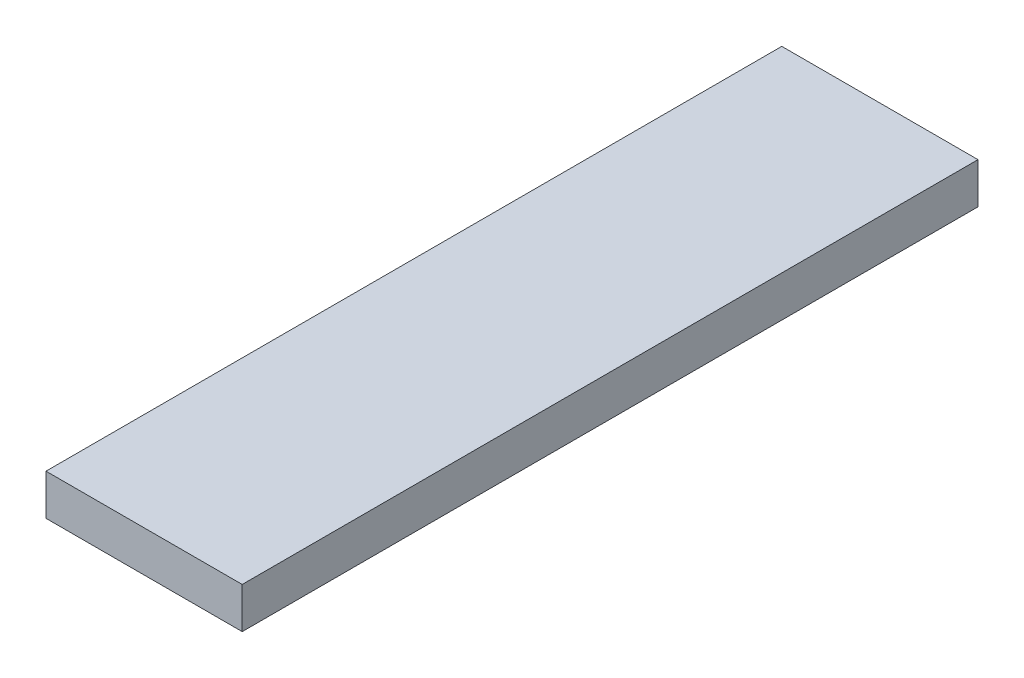
ISO-10303-21;
HEADER;
FILE_DESCRIPTION(('STEP AP214'),'2;1');
FILE_NAME('part.step','',(''),(''),'','','');
FILE_SCHEMA(('AUTOMOTIVE_DESIGN { 1 0 10303 214 1 1 1 1 }'));
ENDSEC;
DATA;
#1=APPLICATION_CONTEXT('core data for automotive mechanical design processes');
#2=APPLICATION_PROTOCOL_DEFINITION('international standard','automotive_design',2000,#1);
#3=PRODUCT_CONTEXT('',#1,'mechanical');
#4=PRODUCT('Part','Part','',(#3));
#5=PRODUCT_RELATED_PRODUCT_CATEGORY('part','',(#4));
#6=PRODUCT_DEFINITION_FORMATION('','',#4);
#7=PRODUCT_DEFINITION_CONTEXT('part definition',#1,'design');
#8=PRODUCT_DEFINITION('design','',#6,#7);
#9=PRODUCT_DEFINITION_SHAPE('','',#8);
#10=(LENGTH_UNIT() NAMED_UNIT(*) SI_UNIT(.MILLI.,.METRE.));
#11=(NAMED_UNIT(*) PLANE_ANGLE_UNIT() SI_UNIT($,.RADIAN.));
#12=(NAMED_UNIT(*) SI_UNIT($,.STERADIAN.) SOLID_ANGLE_UNIT());
#13=UNCERTAINTY_MEASURE_WITH_UNIT(LENGTH_MEASURE(1.E-05),#10,'distance_accuracy_value','');
#14=(GEOMETRIC_REPRESENTATION_CONTEXT(3) GLOBAL_UNCERTAINTY_ASSIGNED_CONTEXT((#13)) GLOBAL_UNIT_ASSIGNED_CONTEXT((#10,
#11,#12)) REPRESENTATION_CONTEXT('',''));
#15=CARTESIAN_POINT('',(0.,0.,0.));
#16=DIRECTION('',(0.,0.,1.));
#17=DIRECTION('',(1.,0.,0.));
#18=AXIS2_PLACEMENT_3D('',#15,#16,#17);
#19=CARTESIAN_POINT('',(-7.62,3.175,0.));
#20=DIRECTION('',(1.,0.,0.));
#21=DIRECTION('',(0.,0.,-1.));
#22=AXIS2_PLACEMENT_3D('',#19,#20,#21);
#23=PLANE('',#22);
#24=DIRECTION('',(0.,0.,1.));
#25=VECTOR('',#24,1.);
#26=CARTESIAN_POINT('',(-7.62,0.,0.));
#27=LINE('',#26,#25);
#28=CARTESIAN_POINT('',(-7.62,0.,-57.15));
#29=VERTEX_POINT('',#28);
#30=CARTESIAN_POINT('',(-7.62,0.,0.));
#31=VERTEX_POINT('',#30);
#32=EDGE_CURVE('E98',#29,#31,#27,.T.);
#33=ORIENTED_EDGE('',*,*,#32,.T.);
#34=DIRECTION('',(0.,-1.,0.));
#35=VECTOR('',#34,1.);
#36=CARTESIAN_POINT('',(-7.62,3.175,0.));
#37=LINE('',#36,#35);
#38=CARTESIAN_POINT('',(-7.62,3.175,0.));
#39=VERTEX_POINT('',#38);
#40=EDGE_CURVE('E11',#39,#31,#37,.T.);
#41=ORIENTED_EDGE('',*,*,#40,.F.);
#42=DIRECTION('',(0.,0.,1.));
#43=VECTOR('',#42,1.);
#44=CARTESIAN_POINT('',(-7.62,3.175,0.));
#45=LINE('',#44,#43);
#46=CARTESIAN_POINT('',(-7.62,3.175,-57.15));
#47=VERTEX_POINT('',#46);
#48=EDGE_CURVE('E86',#47,#39,#45,.T.);
#49=ORIENTED_EDGE('',*,*,#48,.F.);
#50=DIRECTION('',(0.,-1.,0.));
#51=VECTOR('',#50,1.);
#52=CARTESIAN_POINT('',(-7.62,3.175,-57.15));
#53=LINE('',#52,#51);
#54=EDGE_CURVE('E94',#47,#29,#53,.T.);
#55=ORIENTED_EDGE('',*,*,#54,.T.);
#56=EDGE_LOOP('',(#33,#41,#49,#55));
#57=FACE_BOUND('',#56,.T.);
#58=ADVANCED_FACE('F35',(#57),#23,.F.);
#59=CARTESIAN_POINT('',(-7.62,3.175,0.));
#60=DIRECTION('',(0.,0.,-1.));
#61=DIRECTION('',(-1.,0.,0.));
#62=AXIS2_PLACEMENT_3D('',#59,#60,#61);
#63=PLANE('',#62);
#64=DIRECTION('',(1.,0.,0.));
#65=VECTOR('',#64,1.);
#66=CARTESIAN_POINT('',(-7.62,0.,0.));
#67=LINE('',#66,#65);
#68=CARTESIAN_POINT('',(7.62,0.,0.));
#69=VERTEX_POINT('',#68);
#70=EDGE_CURVE('E90',#31,#69,#67,.T.);
#71=ORIENTED_EDGE('',*,*,#70,.T.);
#72=DIRECTION('',(0.,-1.,0.));
#73=VECTOR('',#72,1.);
#74=CARTESIAN_POINT('',(7.62,3.175,0.));
#75=LINE('',#74,#73);
#76=CARTESIAN_POINT('',(7.62,3.175,0.));
#77=VERTEX_POINT('',#76);
#78=EDGE_CURVE('E43',#77,#69,#75,.T.);
#79=ORIENTED_EDGE('',*,*,#78,.F.);
#80=DIRECTION('',(1.,0.,0.));
#81=VECTOR('',#80,1.);
#82=CARTESIAN_POINT('',(-7.62,3.175,0.));
#83=LINE('',#82,#81);
#84=EDGE_CURVE('E81',#39,#77,#83,.T.);
#85=ORIENTED_EDGE('',*,*,#84,.F.);
#86=ORIENTED_EDGE('',*,*,#40,.T.);
#87=EDGE_LOOP('',(#71,#79,#85,#86));
#88=FACE_BOUND('',#87,.T.);
#89=ADVANCED_FACE('F89',(#88),#63,.F.);
#90=CARTESIAN_POINT('',(7.62,3.175,0.));
#91=DIRECTION('',(-1.,0.,0.));
#92=DIRECTION('',(0.,0.,1.));
#93=AXIS2_PLACEMENT_3D('',#90,#91,#92);
#94=PLANE('',#93);
#95=DIRECTION('',(0.,0.,-1.));
#96=VECTOR('',#95,1.);
#97=CARTESIAN_POINT('',(7.62,0.,0.));
#98=LINE('',#97,#96);
#99=CARTESIAN_POINT('',(7.62,0.,-57.15));
#100=VERTEX_POINT('',#99);
#101=EDGE_CURVE('E68',#69,#100,#98,.T.);
#102=ORIENTED_EDGE('',*,*,#101,.T.);
#103=DIRECTION('',(0.,-1.,0.));
#104=VECTOR('',#103,1.);
#105=CARTESIAN_POINT('',(7.62,3.175,-57.15));
#106=LINE('',#105,#104);
#107=CARTESIAN_POINT('',(7.62,3.175,-57.15));
#108=VERTEX_POINT('',#107);
#109=EDGE_CURVE('E91',#108,#100,#106,.T.);
#110=ORIENTED_EDGE('',*,*,#109,.F.);
#111=DIRECTION('',(0.,0.,-1.));
#112=VECTOR('',#111,1.);
#113=CARTESIAN_POINT('',(7.62,3.175,0.));
#114=LINE('',#113,#112);
#115=EDGE_CURVE('E84',#77,#108,#114,.T.);
#116=ORIENTED_EDGE('',*,*,#115,.F.);
#117=ORIENTED_EDGE('',*,*,#78,.T.);
#118=EDGE_LOOP('',(#102,#110,#116,#117));
#119=FACE_BOUND('',#118,.T.);
#120=ADVANCED_FACE('F92',(#119),#94,.F.);
#121=CARTESIAN_POINT('',(-7.62,3.175,-57.15));
#122=DIRECTION('',(0.,0.,1.));
#123=DIRECTION('',(1.,0.,0.));
#124=AXIS2_PLACEMENT_3D('',#121,#122,#123);
#125=PLANE('',#124);
#126=DIRECTION('',(-1.,0.,0.));
#127=VECTOR('',#126,1.);
#128=CARTESIAN_POINT('',(-7.62,0.,-57.15));
#129=LINE('',#128,#127);
#130=EDGE_CURVE('E74',#100,#29,#129,.T.);
#131=ORIENTED_EDGE('',*,*,#130,.T.);
#132=ORIENTED_EDGE('',*,*,#54,.F.);
#133=DIRECTION('',(-1.,0.,0.));
#134=VECTOR('',#133,1.);
#135=CARTESIAN_POINT('',(-7.62,3.175,-57.15));
#136=LINE('',#135,#134);
#137=EDGE_CURVE('E51',#108,#47,#136,.T.);
#138=ORIENTED_EDGE('',*,*,#137,.F.);
#139=ORIENTED_EDGE('',*,*,#109,.T.);
#140=EDGE_LOOP('',(#131,#132,#138,#139));
#141=FACE_BOUND('',#140,.T.);
#142=ADVANCED_FACE('F105',(#141),#125,.F.);
#143=CARTESIAN_POINT('',(0.,3.175,0.));
#144=DIRECTION('',(0.,-1.,0.));
#145=DIRECTION('',(0.,0.,-1.));
#146=AXIS2_PLACEMENT_3D('',#143,#144,#145);
#147=PLANE('',#146);
#148=ORIENTED_EDGE('',*,*,#48,.T.);
#149=ORIENTED_EDGE('',*,*,#84,.T.);
#150=ORIENTED_EDGE('',*,*,#115,.T.);
#151=ORIENTED_EDGE('',*,*,#137,.T.);
#152=EDGE_LOOP('',(#148,#149,#150,#151));
#153=FACE_BOUND('',#152,.T.);
#154=ADVANCED_FACE('F82',(#153),#147,.F.);
#155=CARTESIAN_POINT('',(0.,0.,0.));
#156=DIRECTION('',(0.,-1.,0.));
#157=DIRECTION('',(0.,0.,-1.));
#158=AXIS2_PLACEMENT_3D('',#155,#156,#157);
#159=PLANE('',#158);
#160=ORIENTED_EDGE('',*,*,#32,.F.);
#161=ORIENTED_EDGE('',*,*,#130,.F.);
#162=ORIENTED_EDGE('',*,*,#101,.F.);
#163=ORIENTED_EDGE('',*,*,#70,.F.);
#164=EDGE_LOOP('',(#160,#161,#162,#163));
#165=FACE_BOUND('',#164,.T.);
#166=ADVANCED_FACE('F108',(#165),#159,.T.);
#167=CLOSED_SHELL('',(#58,#89,#120,#142,#154,#166));
#168=MANIFOLD_SOLID_BREP('B2',#167);
#169=ADVANCED_BREP_SHAPE_REPRESENTATION('',(#18,#168),#14);
#170=SHAPE_DEFINITION_REPRESENTATION(#9,#169);
ENDSEC;
END-ISO-10303-21;
